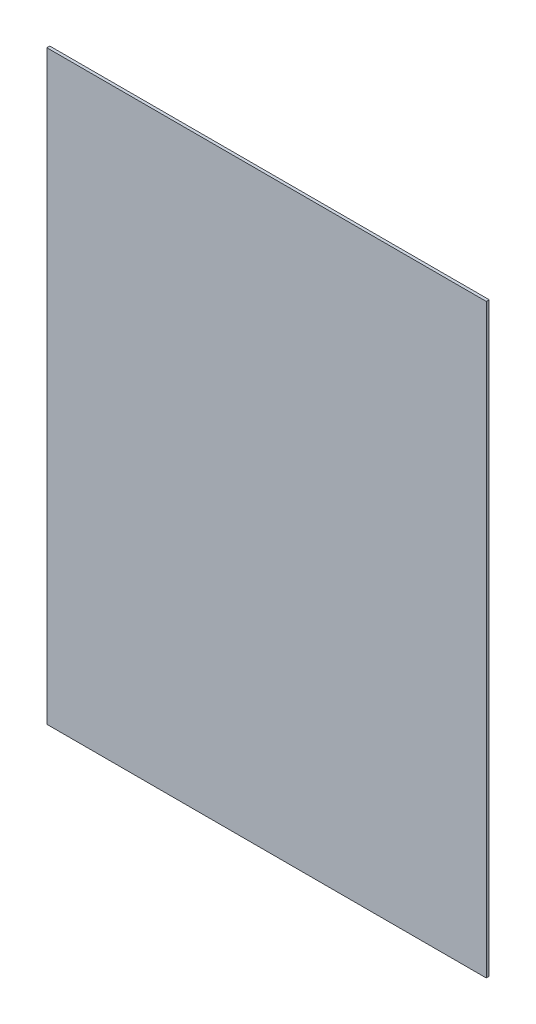
ISO-10303-21;
HEADER;
FILE_DESCRIPTION(('STEP AP214'),'2;1');
FILE_NAME('part.step','',(''),(''),'','','');
FILE_SCHEMA(('AUTOMOTIVE_DESIGN { 1 0 10303 214 1 1 1 1 }'));
ENDSEC;
DATA;
#1=APPLICATION_CONTEXT('core data for automotive mechanical design processes');
#2=APPLICATION_PROTOCOL_DEFINITION('international standard','automotive_design',2000,#1);
#3=PRODUCT_CONTEXT('',#1,'mechanical');
#4=PRODUCT('Part','Part','',(#3));
#5=PRODUCT_RELATED_PRODUCT_CATEGORY('part','',(#4));
#6=PRODUCT_DEFINITION_FORMATION('','',#4);
#7=PRODUCT_DEFINITION_CONTEXT('part definition',#1,'design');
#8=PRODUCT_DEFINITION('design','',#6,#7);
#9=PRODUCT_DEFINITION_SHAPE('','',#8);
#10=(LENGTH_UNIT() NAMED_UNIT(*) SI_UNIT(.MILLI.,.METRE.));
#11=(NAMED_UNIT(*) PLANE_ANGLE_UNIT() SI_UNIT($,.RADIAN.));
#12=(NAMED_UNIT(*) SI_UNIT($,.STERADIAN.) SOLID_ANGLE_UNIT());
#13=UNCERTAINTY_MEASURE_WITH_UNIT(LENGTH_MEASURE(1.E-05),#10,'distance_accuracy_value','');
#14=(GEOMETRIC_REPRESENTATION_CONTEXT(3) GLOBAL_UNCERTAINTY_ASSIGNED_CONTEXT((#13)) GLOBAL_UNIT_ASSIGNED_CONTEXT((#10,
#11,#12)) REPRESENTATION_CONTEXT('',''));
#15=CARTESIAN_POINT('',(0.,0.,0.));
#16=DIRECTION('',(0.,0.,1.));
#17=DIRECTION('',(1.,0.,0.));
#18=AXIS2_PLACEMENT_3D('',#15,#16,#17);
#19=CARTESIAN_POINT('',(-341.463414634146,254.355400696864,2.));
#20=DIRECTION('',(1.,0.,0.));
#21=DIRECTION('',(0.,0.,-1.));
#22=AXIS2_PLACEMENT_3D('',#19,#20,#21);
#23=PLANE('',#22);
#24=DIRECTION('',(0.,-1.,0.));
#25=VECTOR('',#24,1.);
#26=CARTESIAN_POINT('',(-341.463414634146,254.355400696864,0.));
#27=LINE('',#26,#25);
#28=CARTESIAN_POINT('',(-341.463414634146,254.355400696864,0.));
#29=VERTEX_POINT('',#28);
#30=CARTESIAN_POINT('',(-341.463414634146,-145.644599303136,0.));
#31=VERTEX_POINT('',#30);
#32=EDGE_CURVE('E98',#29,#31,#27,.T.);
#33=ORIENTED_EDGE('',*,*,#32,.T.);
#34=DIRECTION('',(0.,0.,-1.));
#35=VECTOR('',#34,1.);
#36=CARTESIAN_POINT('',(-341.463414634146,-145.644599303136,2.));
#37=LINE('',#36,#35);
#38=CARTESIAN_POINT('',(-341.463414634146,-145.644599303136,2.));
#39=VERTEX_POINT('',#38);
#40=EDGE_CURVE('E11',#39,#31,#37,.T.);
#41=ORIENTED_EDGE('',*,*,#40,.F.);
#42=DIRECTION('',(0.,-1.,0.));
#43=VECTOR('',#42,1.);
#44=CARTESIAN_POINT('',(-341.463414634146,254.355400696864,2.));
#45=LINE('',#44,#43);
#46=CARTESIAN_POINT('',(-341.463414634146,254.355400696864,2.));
#47=VERTEX_POINT('',#46);
#48=EDGE_CURVE('E86',#47,#39,#45,.T.);
#49=ORIENTED_EDGE('',*,*,#48,.F.);
#50=DIRECTION('',(0.,0.,-1.));
#51=VECTOR('',#50,1.);
#52=CARTESIAN_POINT('',(-341.463414634146,254.355400696864,2.));
#53=LINE('',#52,#51);
#54=EDGE_CURVE('E94',#47,#29,#53,.T.);
#55=ORIENTED_EDGE('',*,*,#54,.T.);
#56=EDGE_LOOP('',(#33,#41,#49,#55));
#57=FACE_BOUND('',#56,.T.);
#58=ADVANCED_FACE('F35',(#57),#23,.F.);
#59=CARTESIAN_POINT('',(-341.463414634146,-145.644599303136,2.));
#60=DIRECTION('',(0.,1.,0.));
#61=DIRECTION('',(0.,0.,1.));
#62=AXIS2_PLACEMENT_3D('',#59,#60,#61);
#63=PLANE('',#62);
#64=DIRECTION('',(1.,0.,0.));
#65=VECTOR('',#64,1.);
#66=CARTESIAN_POINT('',(-341.463414634146,-145.644599303136,0.));
#67=LINE('',#66,#65);
#68=CARTESIAN_POINT('',(-41.4634146341463,-145.644599303136,0.));
#69=VERTEX_POINT('',#68);
#70=EDGE_CURVE('E90',#31,#69,#67,.T.);
#71=ORIENTED_EDGE('',*,*,#70,.T.);
#72=DIRECTION('',(0.,0.,-1.));
#73=VECTOR('',#72,1.);
#74=CARTESIAN_POINT('',(-41.4634146341463,-145.644599303136,2.));
#75=LINE('',#74,#73);
#76=CARTESIAN_POINT('',(-41.4634146341463,-145.644599303136,2.));
#77=VERTEX_POINT('',#76);
#78=EDGE_CURVE('E43',#77,#69,#75,.T.);
#79=ORIENTED_EDGE('',*,*,#78,.F.);
#80=DIRECTION('',(1.,0.,0.));
#81=VECTOR('',#80,1.);
#82=CARTESIAN_POINT('',(-341.463414634146,-145.644599303136,2.));
#83=LINE('',#82,#81);
#84=EDGE_CURVE('E81',#39,#77,#83,.T.);
#85=ORIENTED_EDGE('',*,*,#84,.F.);
#86=ORIENTED_EDGE('',*,*,#40,.T.);
#87=EDGE_LOOP('',(#71,#79,#85,#86));
#88=FACE_BOUND('',#87,.T.);
#89=ADVANCED_FACE('F89',(#88),#63,.F.);
#90=CARTESIAN_POINT('',(-41.4634146341464,254.355400696864,2.));
#91=DIRECTION('',(-1.,0.,0.));
#92=DIRECTION('',(0.,-1.,0.));
#93=AXIS2_PLACEMENT_3D('',#90,#91,#92);
#94=PLANE('',#93);
#95=DIRECTION('',(0.,1.,0.));
#96=VECTOR('',#95,1.);
#97=CARTESIAN_POINT('',(-41.4634146341464,254.355400696864,0.));
#98=LINE('',#97,#96);
#99=CARTESIAN_POINT('',(-41.4634146341464,254.355400696864,0.));
#100=VERTEX_POINT('',#99);
#101=EDGE_CURVE('E68',#69,#100,#98,.T.);
#102=ORIENTED_EDGE('',*,*,#101,.T.);
#103=DIRECTION('',(0.,0.,-1.));
#104=VECTOR('',#103,1.);
#105=CARTESIAN_POINT('',(-41.4634146341464,254.355400696864,2.));
#106=LINE('',#105,#104);
#107=CARTESIAN_POINT('',(-41.4634146341464,254.355400696864,2.));
#108=VERTEX_POINT('',#107);
#109=EDGE_CURVE('E91',#108,#100,#106,.T.);
#110=ORIENTED_EDGE('',*,*,#109,.F.);
#111=DIRECTION('',(0.,1.,0.));
#112=VECTOR('',#111,1.);
#113=CARTESIAN_POINT('',(-41.4634146341464,254.355400696864,2.));
#114=LINE('',#113,#112);
#115=EDGE_CURVE('E84',#77,#108,#114,.T.);
#116=ORIENTED_EDGE('',*,*,#115,.F.);
#117=ORIENTED_EDGE('',*,*,#78,.T.);
#118=EDGE_LOOP('',(#102,#110,#116,#117));
#119=FACE_BOUND('',#118,.T.);
#120=ADVANCED_FACE('F92',(#119),#94,.F.);
#121=CARTESIAN_POINT('',(-341.463414634146,254.355400696864,2.));
#122=DIRECTION('',(0.,-1.,0.));
#123=DIRECTION('',(0.,0.,-1.));
#124=AXIS2_PLACEMENT_3D('',#121,#122,#123);
#125=PLANE('',#124);
#126=DIRECTION('',(-1.,0.,0.));
#127=VECTOR('',#126,1.);
#128=CARTESIAN_POINT('',(-341.463414634146,254.355400696864,0.));
#129=LINE('',#128,#127);
#130=EDGE_CURVE('E74',#100,#29,#129,.T.);
#131=ORIENTED_EDGE('',*,*,#130,.T.);
#132=ORIENTED_EDGE('',*,*,#54,.F.);
#133=DIRECTION('',(-1.,0.,0.));
#134=VECTOR('',#133,1.);
#135=CARTESIAN_POINT('',(-341.463414634146,254.355400696864,2.));
#136=LINE('',#135,#134);
#137=EDGE_CURVE('E51',#108,#47,#136,.T.);
#138=ORIENTED_EDGE('',*,*,#137,.F.);
#139=ORIENTED_EDGE('',*,*,#109,.T.);
#140=EDGE_LOOP('',(#131,#132,#138,#139));
#141=FACE_BOUND('',#140,.T.);
#142=ADVANCED_FACE('F105',(#141),#125,.F.);
#143=CARTESIAN_POINT('',(0.,0.,2.));
#144=DIRECTION('',(0.,0.,1.));
#145=DIRECTION('',(1.,0.,0.));
#146=AXIS2_PLACEMENT_3D('',#143,#144,#145);
#147=PLANE('',#146);
#148=ORIENTED_EDGE('',*,*,#48,.T.);
#149=ORIENTED_EDGE('',*,*,#84,.T.);
#150=ORIENTED_EDGE('',*,*,#115,.T.);
#151=ORIENTED_EDGE('',*,*,#137,.T.);
#152=EDGE_LOOP('',(#148,#149,#150,#151));
#153=FACE_BOUND('',#152,.T.);
#154=ADVANCED_FACE('F82',(#153),#147,.T.);
#155=CARTESIAN_POINT('',(0.,0.,0.));
#156=DIRECTION('',(0.,0.,1.));
#157=DIRECTION('',(1.,0.,0.));
#158=AXIS2_PLACEMENT_3D('',#155,#156,#157);
#159=PLANE('',#158);
#160=ORIENTED_EDGE('',*,*,#32,.F.);
#161=ORIENTED_EDGE('',*,*,#130,.F.);
#162=ORIENTED_EDGE('',*,*,#101,.F.);
#163=ORIENTED_EDGE('',*,*,#70,.F.);
#164=EDGE_LOOP('',(#160,#161,#162,#163));
#165=FACE_BOUND('',#164,.T.);
#166=ADVANCED_FACE('F108',(#165),#159,.F.);
#167=CLOSED_SHELL('',(#58,#89,#120,#142,#154,#166));
#168=MANIFOLD_SOLID_BREP('B2',#167);
#169=ADVANCED_BREP_SHAPE_REPRESENTATION('',(#18,#168),#14);
#170=SHAPE_DEFINITION_REPRESENTATION(#9,#169);
ENDSEC;
END-ISO-10303-21;
